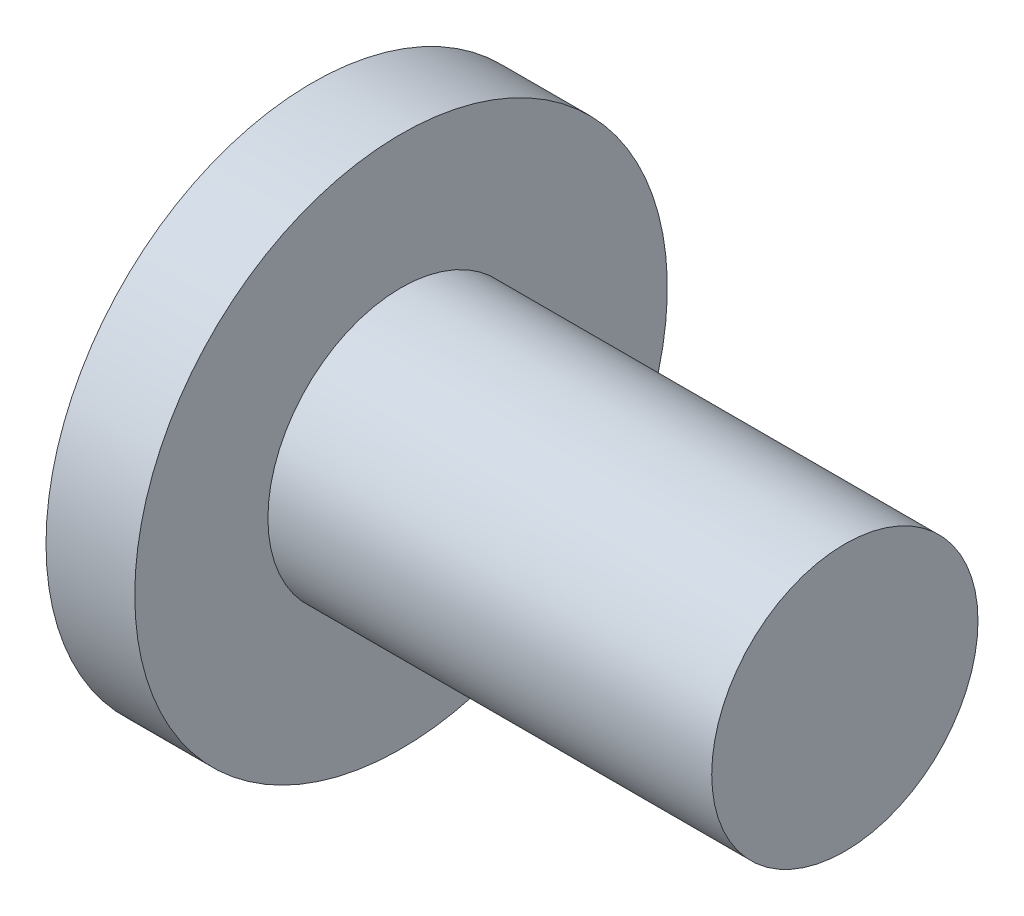
ISO-10303-21;
HEADER;
FILE_DESCRIPTION(('STEP AP214'),'2;1');
FILE_NAME('part.step','',(''),(''),'','','');
FILE_SCHEMA(('AUTOMOTIVE_DESIGN { 1 0 10303 214 1 1 1 1 }'));
ENDSEC;
DATA;
#1=APPLICATION_CONTEXT('core data for automotive mechanical design processes');
#2=APPLICATION_PROTOCOL_DEFINITION('international standard','automotive_design',2000,#1);
#3=PRODUCT_CONTEXT('',#1,'mechanical');
#4=PRODUCT('Part','Part','',(#3));
#5=PRODUCT_RELATED_PRODUCT_CATEGORY('part','',(#4));
#6=PRODUCT_DEFINITION_FORMATION('','',#4);
#7=PRODUCT_DEFINITION_CONTEXT('part definition',#1,'design');
#8=PRODUCT_DEFINITION('design','',#6,#7);
#9=PRODUCT_DEFINITION_SHAPE('','',#8);
#10=(LENGTH_UNIT() NAMED_UNIT(*) SI_UNIT(.MILLI.,.METRE.));
#11=(NAMED_UNIT(*) PLANE_ANGLE_UNIT() SI_UNIT($,.RADIAN.));
#12=(NAMED_UNIT(*) SI_UNIT($,.STERADIAN.) SOLID_ANGLE_UNIT());
#13=UNCERTAINTY_MEASURE_WITH_UNIT(LENGTH_MEASURE(1.E-05),#10,'distance_accuracy_value','');
#14=(GEOMETRIC_REPRESENTATION_CONTEXT(3) GLOBAL_UNCERTAINTY_ASSIGNED_CONTEXT((#13)) GLOBAL_UNIT_ASSIGNED_CONTEXT((#10,
#11,#12)) REPRESENTATION_CONTEXT('',''));
#15=CARTESIAN_POINT('',(0.,0.,0.));
#16=DIRECTION('',(0.,0.,1.));
#17=DIRECTION('',(1.,0.,0.));
#18=AXIS2_PLACEMENT_3D('',#15,#16,#17);
#19=CARTESIAN_POINT('',(0.,0.,0.));
#20=DIRECTION('',(-1.,0.,0.));
#21=DIRECTION('',(0.,0.,1.));
#22=AXIS2_PLACEMENT_3D('',#19,#20,#21);
#23=PLANE('',#22);
#24=CARTESIAN_POINT('',(0.,0.,0.));
#25=DIRECTION('',(-1.,0.,0.));
#26=DIRECTION('',(0.,0.,1.));
#27=AXIS2_PLACEMENT_3D('',#24,#25,#26);
#28=CIRCLE('',#27,3.);
#29=CARTESIAN_POINT('',(0.,0.,3.));
#30=VERTEX_POINT('',#29);
#31=EDGE_CURVE('E10',#30,#30,#28,.T.);
#32=ORIENTED_EDGE('',*,*,#31,.F.);
#33=EDGE_LOOP('',(#32));
#34=FACE_BOUND('',#33,.T.);
#35=ADVANCED_FACE('F32',(#34),#23,.F.);
#36=CARTESIAN_POINT('',(-12.,0.,0.));
#37=DIRECTION('',(-1.,0.,0.));
#38=DIRECTION('',(0.,0.,1.));
#39=AXIS2_PLACEMENT_3D('',#36,#37,#38);
#40=CYLINDRICAL_SURFACE('',#39,3.);
#41=CARTESIAN_POINT('',(-10.,0.,0.));
#42=DIRECTION('',(-1.,0.,0.));
#43=DIRECTION('',(0.,0.,1.));
#44=AXIS2_PLACEMENT_3D('',#41,#42,#43);
#45=CIRCLE('',#44,3.);
#46=CARTESIAN_POINT('',(-10.,0.,3.));
#47=VERTEX_POINT('',#46);
#48=EDGE_CURVE('E38',#47,#47,#45,.T.);
#49=ORIENTED_EDGE('',*,*,#48,.F.);
#50=EDGE_LOOP('',(#49));
#51=FACE_BOUND('',#50,.T.);
#52=ORIENTED_EDGE('',*,*,#31,.T.);
#53=EDGE_LOOP('',(#52));
#54=FACE_BOUND('',#53,.T.);
#55=ADVANCED_FACE('F62',(#51,#54),#40,.T.);
#56=CARTESIAN_POINT('',(-10.,3.,0.));
#57=DIRECTION('',(-1.,0.,0.));
#58=DIRECTION('',(0.,0.,1.));
#59=AXIS2_PLACEMENT_3D('',#56,#57,#58);
#60=PLANE('',#59);
#61=CARTESIAN_POINT('',(-10.,0.,0.));
#62=DIRECTION('',(-1.,0.,0.));
#63=DIRECTION('',(0.,0.,1.));
#64=AXIS2_PLACEMENT_3D('',#61,#62,#63);
#65=CIRCLE('',#64,6.);
#66=CARTESIAN_POINT('',(-10.,0.,6.));
#67=VERTEX_POINT('',#66);
#68=EDGE_CURVE('E42',#67,#67,#65,.T.);
#69=ORIENTED_EDGE('',*,*,#68,.F.);
#70=EDGE_LOOP('',(#69));
#71=FACE_BOUND('',#70,.T.);
#72=ORIENTED_EDGE('',*,*,#48,.T.);
#73=EDGE_LOOP('',(#72));
#74=FACE_BOUND('',#73,.T.);
#75=ADVANCED_FACE('F57',(#71,#74),#60,.F.);
#76=CARTESIAN_POINT('',(-12.,0.,0.));
#77=DIRECTION('',(-1.,0.,0.));
#78=DIRECTION('',(0.,0.,1.));
#79=AXIS2_PLACEMENT_3D('',#76,#77,#78);
#80=CYLINDRICAL_SURFACE('',#79,6.);
#81=CARTESIAN_POINT('',(-12.,0.,0.));
#82=DIRECTION('',(-1.,0.,0.));
#83=DIRECTION('',(0.,0.,1.));
#84=AXIS2_PLACEMENT_3D('',#81,#82,#83);
#85=CIRCLE('',#84,6.);
#86=CARTESIAN_POINT('',(-12.,0.,6.));
#87=VERTEX_POINT('',#86);
#88=EDGE_CURVE('E46',#87,#87,#85,.T.);
#89=ORIENTED_EDGE('',*,*,#88,.F.);
#90=EDGE_LOOP('',(#89));
#91=FACE_BOUND('',#90,.T.);
#92=ORIENTED_EDGE('',*,*,#68,.T.);
#93=EDGE_LOOP('',(#92));
#94=FACE_BOUND('',#93,.T.);
#95=ADVANCED_FACE('F54',(#91,#94),#80,.T.);
#96=CARTESIAN_POINT('',(-12.,6.,0.));
#97=DIRECTION('',(1.,0.,0.));
#98=DIRECTION('',(0.,0.,-1.));
#99=AXIS2_PLACEMENT_3D('',#96,#97,#98);
#100=PLANE('',#99);
#101=ORIENTED_EDGE('',*,*,#88,.T.);
#102=EDGE_LOOP('',(#101));
#103=FACE_BOUND('',#102,.T.);
#104=ADVANCED_FACE('F52',(#103),#100,.F.);
#105=CLOSED_SHELL('',(#35,#55,#75,#95,#104));
#106=MANIFOLD_SOLID_BREP('B2',#105);
#107=ADVANCED_BREP_SHAPE_REPRESENTATION('',(#18,#106),#14);
#108=SHAPE_DEFINITION_REPRESENTATION(#9,#107);
ENDSEC;
END-ISO-10303-21;
